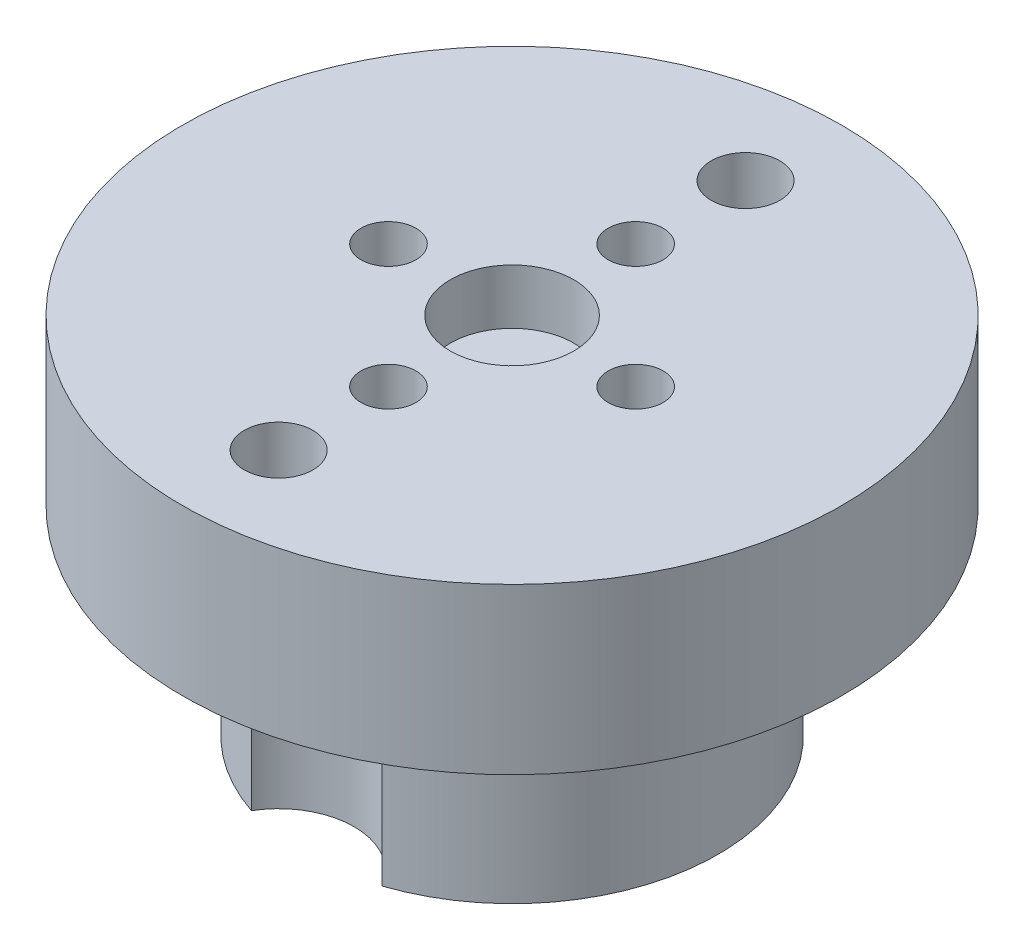
ISO-10303-21;
HEADER;
FILE_DESCRIPTION(('STEP AP214'),'2;1');
FILE_NAME('part.step','',(''),(''),'','','');
FILE_SCHEMA(('AUTOMOTIVE_DESIGN { 1 0 10303 214 1 1 1 1 }'));
ENDSEC;
DATA;
#1=APPLICATION_CONTEXT('core data for automotive mechanical design processes');
#2=APPLICATION_PROTOCOL_DEFINITION('international standard','automotive_design',2000,#1);
#3=PRODUCT_CONTEXT('',#1,'mechanical');
#4=PRODUCT('Part','Part','',(#3));
#5=PRODUCT_RELATED_PRODUCT_CATEGORY('part','',(#4));
#6=PRODUCT_DEFINITION_FORMATION('','',#4);
#7=PRODUCT_DEFINITION_CONTEXT('part definition',#1,'design');
#8=PRODUCT_DEFINITION('design','',#6,#7);
#9=PRODUCT_DEFINITION_SHAPE('','',#8);
#10=(LENGTH_UNIT() NAMED_UNIT(*) SI_UNIT(.MILLI.,.METRE.));
#11=(NAMED_UNIT(*) PLANE_ANGLE_UNIT() SI_UNIT($,.RADIAN.));
#12=(NAMED_UNIT(*) SI_UNIT($,.STERADIAN.) SOLID_ANGLE_UNIT());
#13=UNCERTAINTY_MEASURE_WITH_UNIT(LENGTH_MEASURE(1.E-05),#10,'distance_accuracy_value','');
#14=(GEOMETRIC_REPRESENTATION_CONTEXT(3) GLOBAL_UNCERTAINTY_ASSIGNED_CONTEXT((#13)) GLOBAL_UNIT_ASSIGNED_CONTEXT((#10,
#11,#12)) REPRESENTATION_CONTEXT('',''));
#15=CARTESIAN_POINT('',(0.,0.,0.));
#16=DIRECTION('',(0.,0.,1.));
#17=DIRECTION('',(1.,0.,0.));
#18=AXIS2_PLACEMENT_3D('',#15,#16,#17);
#19=CARTESIAN_POINT('',(0.,0.,0.));
#20=DIRECTION('',(0.,-1.,0.));
#21=DIRECTION('',(0.,0.,-1.));
#22=AXIS2_PLACEMENT_3D('',#19,#20,#21);
#23=CYLINDRICAL_SURFACE('',#22,7.5);
#24=DIRECTION('',(0.,-1.,0.));
#25=VECTOR('',#24,1.);
#26=CARTESIAN_POINT('',(2.3751678824292,4.,-7.1139705882353));
#27=LINE('',#26,#25);
#28=CARTESIAN_POINT('',(2.37516788242919,5.25,-7.1139705882353));
#29=VERTEX_POINT('',#28);
#30=CARTESIAN_POINT('',(2.3751678824292,0.,-7.1139705882353));
#31=VERTEX_POINT('',#30);
#32=EDGE_CURVE('E11',#29,#31,#27,.T.);
#33=ORIENTED_EDGE('',*,*,#32,.F.);
#34=CARTESIAN_POINT('',(0.,5.25,0.));
#35=DIRECTION('',(0.,-1.,0.));
#36=DIRECTION('',(0.,0.,-1.));
#37=AXIS2_PLACEMENT_3D('',#34,#35,#36);
#38=CIRCLE('',#37,7.5);
#39=CARTESIAN_POINT('',(2.3751678824292,5.25,7.1139705882353));
#40=VERTEX_POINT('',#39);
#41=EDGE_CURVE('E120',#29,#40,#38,.T.);
#42=ORIENTED_EDGE('',*,*,#41,.T.);
#43=DIRECTION('',(0.,-1.,0.));
#44=VECTOR('',#43,1.);
#45=CARTESIAN_POINT('',(2.37516788242919,4.,7.1139705882353));
#46=LINE('',#45,#44);
#47=CARTESIAN_POINT('',(2.37516788242919,0.,7.1139705882353));
#48=VERTEX_POINT('',#47);
#49=EDGE_CURVE('E111',#48,#40,#46,.F.);
#50=ORIENTED_EDGE('',*,*,#49,.F.);
#51=CARTESIAN_POINT('',(0.,0.,0.));
#52=DIRECTION('',(0.,-1.,0.));
#53=DIRECTION('',(0.,0.,-1.));
#54=AXIS2_PLACEMENT_3D('',#51,#52,#53);
#55=CIRCLE('',#54,7.5);
#56=EDGE_CURVE('E54',#31,#48,#55,.T.);
#57=ORIENTED_EDGE('',*,*,#56,.F.);
#58=EDGE_LOOP('',(#33,#42,#50,#57));
#59=FACE_BOUND('',#58,.T.);
#60=ADVANCED_FACE('F33',(#59),#23,.T.);
#61=CARTESIAN_POINT('',(0.,3.25,-8.5));
#62=DIRECTION('',(0.,1.,0.));
#63=DIRECTION('',(0.,0.,1.));
#64=AXIS2_PLACEMENT_3D('',#61,#62,#63);
#65=CYLINDRICAL_SURFACE('',#64,1.25);
#66=CARTESIAN_POINT('',(0.,13.25,-8.5));
#67=DIRECTION('',(0.,1.,0.));
#68=DIRECTION('',(0.,0.,1.));
#69=AXIS2_PLACEMENT_3D('',#66,#67,#68);
#70=CIRCLE('',#69,1.25);
#71=CARTESIAN_POINT('',(0.,13.25,-7.25));
#72=VERTEX_POINT('',#71);
#73=EDGE_CURVE('E183',#72,#72,#70,.T.);
#74=ORIENTED_EDGE('',*,*,#73,.T.);
#75=EDGE_LOOP('',(#74));
#76=FACE_BOUND('',#75,.T.);
#77=CARTESIAN_POINT('',(0.,8.,-8.5));
#78=DIRECTION('',(0.,-1.,0.));
#79=DIRECTION('',(0.,0.,-1.));
#80=AXIS2_PLACEMENT_3D('',#77,#78,#79);
#81=CIRCLE('',#80,1.25);
#82=CARTESIAN_POINT('',(0.,8.,-9.75));
#83=VERTEX_POINT('',#82);
#84=EDGE_CURVE('E142',#83,#83,#81,.F.);
#85=ORIENTED_EDGE('',*,*,#84,.F.);
#86=EDGE_LOOP('',(#85));
#87=FACE_BOUND('',#86,.T.);
#88=ADVANCED_FACE('F235',(#76,#87),#65,.F.);
#89=CARTESIAN_POINT('',(0.,3.25,8.5));
#90=DIRECTION('',(0.,1.,0.));
#91=DIRECTION('',(0.,0.,1.));
#92=AXIS2_PLACEMENT_3D('',#89,#90,#91);
#93=CYLINDRICAL_SURFACE('',#92,1.25);
#94=CARTESIAN_POINT('',(0.,13.25,8.5));
#95=DIRECTION('',(0.,1.,0.));
#96=DIRECTION('',(0.,0.,1.));
#97=AXIS2_PLACEMENT_3D('',#94,#95,#96);
#98=CIRCLE('',#97,1.25);
#99=CARTESIAN_POINT('',(0.,13.25,9.75));
#100=VERTEX_POINT('',#99);
#101=EDGE_CURVE('E180',#100,#100,#98,.T.);
#102=ORIENTED_EDGE('',*,*,#101,.T.);
#103=EDGE_LOOP('',(#102));
#104=FACE_BOUND('',#103,.T.);
#105=CARTESIAN_POINT('',(0.,8.,8.5));
#106=DIRECTION('',(0.,-1.,0.));
#107=DIRECTION('',(0.,0.,-1.));
#108=AXIS2_PLACEMENT_3D('',#105,#106,#107);
#109=CIRCLE('',#108,1.25);
#110=CARTESIAN_POINT('',(0.,8.,7.25));
#111=VERTEX_POINT('',#110);
#112=EDGE_CURVE('E134',#111,#111,#109,.F.);
#113=ORIENTED_EDGE('',*,*,#112,.F.);
#114=EDGE_LOOP('',(#113));
#115=FACE_BOUND('',#114,.T.);
#116=ADVANCED_FACE('F240',(#104,#115),#93,.F.);
#117=CARTESIAN_POINT('',(0.,0.,0.));
#118=DIRECTION('',(0.,-1.,0.));
#119=DIRECTION('',(0.,0.,-1.));
#120=AXIS2_PLACEMENT_3D('',#117,#118,#119);
#121=CYLINDRICAL_SURFACE('',#120,8.5);
#122=DIRECTION('',(0.,-1.,0.));
#123=VECTOR('',#122,1.);
#124=CARTESIAN_POINT('',(-2.71378073188064,4.,-8.05514705882353));
#125=LINE('',#124,#123);
#126=CARTESIAN_POINT('',(-2.71378073188064,5.25,-8.05514705882353));
#127=VERTEX_POINT('',#126);
#128=CARTESIAN_POINT('',(-2.71378073188064,7.25,-8.05514705882353));
#129=VERTEX_POINT('',#128);
#130=EDGE_CURVE('E155',#127,#129,#125,.F.);
#131=ORIENTED_EDGE('',*,*,#130,.F.);
#132=CARTESIAN_POINT('',(0.,5.25,0.));
#133=DIRECTION('',(0.,-1.,0.));
#134=DIRECTION('',(0.,0.,-1.));
#135=AXIS2_PLACEMENT_3D('',#132,#133,#134);
#136=CIRCLE('',#135,8.5);
#137=CARTESIAN_POINT('',(-2.71378073188064,5.25,8.05514705882353));
#138=VERTEX_POINT('',#137);
#139=EDGE_CURVE('E122',#138,#127,#136,.T.);
#140=ORIENTED_EDGE('',*,*,#139,.F.);
#141=DIRECTION('',(0.,-1.,0.));
#142=VECTOR('',#141,1.);
#143=CARTESIAN_POINT('',(-2.71378073188064,4.,8.05514705882353));
#144=LINE('',#143,#142);
#145=CARTESIAN_POINT('',(-2.71378073188065,7.25,8.05514705882353));
#146=VERTEX_POINT('',#145);
#147=EDGE_CURVE('E177',#146,#138,#144,.T.);
#148=ORIENTED_EDGE('',*,*,#147,.F.);
#149=CARTESIAN_POINT('',(0.,7.25,0.));
#150=DIRECTION('',(0.,-1.,0.));
#151=DIRECTION('',(0.,0.,-1.));
#152=AXIS2_PLACEMENT_3D('',#149,#150,#151);
#153=CIRCLE('',#152,8.5);
#154=EDGE_CURVE('E125',#146,#129,#153,.T.);
#155=ORIENTED_EDGE('',*,*,#154,.T.);
#156=EDGE_LOOP('',(#131,#140,#148,#155));
#157=FACE_BOUND('',#156,.T.);
#158=ADVANCED_FACE('F232',(#157),#121,.T.);
#159=CARTESIAN_POINT('',(8.5,5.25,0.));
#160=DIRECTION('',(0.,-1.,0.));
#161=DIRECTION('',(0.,0.,-1.));
#162=AXIS2_PLACEMENT_3D('',#159,#160,#161);
#163=PLANE('',#162);
#164=CARTESIAN_POINT('',(0.,5.25,-8.5));
#165=DIRECTION('',(0.,-1.,0.));
#166=DIRECTION('',(0.,0.,-1.));
#167=AXIS2_PLACEMENT_3D('',#164,#165,#166);
#168=CIRCLE('',#167,2.75);
#169=CARTESIAN_POINT('',(2.71378073188064,5.25,-8.05514705882353));
#170=VERTEX_POINT('',#169);
#171=EDGE_CURVE('E99',#170,#29,#168,.T.);
#172=ORIENTED_EDGE('',*,*,#171,.F.);
#173=CARTESIAN_POINT('',(2.71378073188065,5.25,8.05514705882353));
#174=VERTEX_POINT('',#173);
#175=EDGE_CURVE('E123',#170,#174,#136,.T.);
#176=ORIENTED_EDGE('',*,*,#175,.T.);
#177=CARTESIAN_POINT('',(0.,5.25,8.5));
#178=DIRECTION('',(0.,-1.,0.));
#179=DIRECTION('',(0.,0.,-1.));
#180=AXIS2_PLACEMENT_3D('',#177,#178,#179);
#181=CIRCLE('',#180,2.75);
#182=EDGE_CURVE('E137',#40,#174,#181,.T.);
#183=ORIENTED_EDGE('',*,*,#182,.F.);
#184=ORIENTED_EDGE('',*,*,#41,.F.);
#185=EDGE_LOOP('',(#172,#176,#183,#184));
#186=FACE_BOUND('',#185,.T.);
#187=ADVANCED_FACE('F252',(#186),#163,.T.);
#188=CARTESIAN_POINT('',(0.,0.,0.));
#189=DIRECTION('',(0.,-1.,0.));
#190=DIRECTION('',(0.,0.,-1.));
#191=AXIS2_PLACEMENT_3D('',#188,#189,#190);
#192=PLANE('',#191);
#193=CARTESIAN_POINT('',(0.,0.,-8.5));
#194=DIRECTION('',(0.,-1.,0.));
#195=DIRECTION('',(0.,0.,-1.));
#196=AXIS2_PLACEMENT_3D('',#193,#194,#195);
#197=CIRCLE('',#196,2.75);
#198=CARTESIAN_POINT('',(-2.37516788242919,0.,-7.1139705882353));
#199=VERTEX_POINT('',#198);
#200=EDGE_CURVE('E47',#31,#199,#197,.T.);
#201=ORIENTED_EDGE('',*,*,#200,.F.);
#202=ORIENTED_EDGE('',*,*,#56,.T.);
#203=CARTESIAN_POINT('',(0.,0.,8.5));
#204=DIRECTION('',(0.,-1.,0.));
#205=DIRECTION('',(0.,0.,-1.));
#206=AXIS2_PLACEMENT_3D('',#203,#204,#205);
#207=CIRCLE('',#206,2.75);
#208=CARTESIAN_POINT('',(-2.3751678824292,0.,7.1139705882353));
#209=VERTEX_POINT('',#208);
#210=EDGE_CURVE('E162',#209,#48,#207,.T.);
#211=ORIENTED_EDGE('',*,*,#210,.F.);
#212=EDGE_CURVE('E105',#209,#199,#55,.T.);
#213=ORIENTED_EDGE('',*,*,#212,.T.);
#214=EDGE_LOOP('',(#201,#202,#211,#213));
#215=FACE_BOUND('',#214,.T.);
#216=CARTESIAN_POINT('',(0.,0.,-4.5));
#217=DIRECTION('',(0.,1.,0.));
#218=DIRECTION('',(1.,0.,0.));
#219=AXIS2_PLACEMENT_3D('',#216,#217,#218);
#220=CIRCLE('',#219,1.);
#221=CARTESIAN_POINT('',(1.00000000000005,0.,-4.49999999999999));
#222=VERTEX_POINT('',#221);
#223=EDGE_CURVE('E187',#222,#222,#220,.T.);
#224=ORIENTED_EDGE('',*,*,#223,.T.);
#225=EDGE_LOOP('',(#224));
#226=FACE_BOUND('',#225,.T.);
#227=CARTESIAN_POINT('',(-4.5,0.,0.));
#228=DIRECTION('',(0.,1.,0.));
#229=DIRECTION('',(0.,0.,-1.));
#230=AXIS2_PLACEMENT_3D('',#227,#228,#229);
#231=CIRCLE('',#230,1.);
#232=CARTESIAN_POINT('',(-4.5,0.,-1.));
#233=VERTEX_POINT('',#232);
#234=EDGE_CURVE('E193',#233,#233,#231,.T.);
#235=ORIENTED_EDGE('',*,*,#234,.T.);
#236=EDGE_LOOP('',(#235));
#237=FACE_BOUND('',#236,.T.);
#238=CARTESIAN_POINT('',(0.,0.,4.5));
#239=DIRECTION('',(0.,1.,0.));
#240=DIRECTION('',(-1.,0.,0.));
#241=AXIS2_PLACEMENT_3D('',#238,#239,#240);
#242=CIRCLE('',#241,1.);
#243=CARTESIAN_POINT('',(-1.00000000000002,0.,4.5));
#244=VERTEX_POINT('',#243);
#245=EDGE_CURVE('E199',#244,#244,#242,.T.);
#246=ORIENTED_EDGE('',*,*,#245,.T.);
#247=EDGE_LOOP('',(#246));
#248=FACE_BOUND('',#247,.T.);
#249=CARTESIAN_POINT('',(4.5,0.,0.));
#250=DIRECTION('',(0.,1.,0.));
#251=DIRECTION('',(0.,0.,1.));
#252=AXIS2_PLACEMENT_3D('',#249,#250,#251);
#253=CIRCLE('',#252,1.);
#254=CARTESIAN_POINT('',(4.5,0.,1.));
#255=VERTEX_POINT('',#254);
#256=EDGE_CURVE('E112',#255,#255,#253,.T.);
#257=ORIENTED_EDGE('',*,*,#256,.T.);
#258=EDGE_LOOP('',(#257));
#259=FACE_BOUND('',#258,.T.);
#260=ADVANCED_FACE('F35',(#215,#226,#237,#248,#259),#192,.T.);
#261=CARTESIAN_POINT('',(0.,13.25,0.));
#262=DIRECTION('',(0.,1.,0.));
#263=DIRECTION('',(0.,0.,1.));
#264=AXIS2_PLACEMENT_3D('',#261,#262,#263);
#265=PLANE('',#264);
#266=CARTESIAN_POINT('',(0.,13.25,0.));
#267=DIRECTION('',(0.,1.,0.));
#268=DIRECTION('',(0.,0.,1.));
#269=AXIS2_PLACEMENT_3D('',#266,#267,#268);
#270=CIRCLE('',#269,2.25);
#271=CARTESIAN_POINT('',(0.,13.25,2.25));
#272=VERTEX_POINT('',#271);
#273=EDGE_CURVE('E278',#272,#272,#270,.T.);
#274=ORIENTED_EDGE('',*,*,#273,.F.);
#275=EDGE_LOOP('',(#274));
#276=FACE_BOUND('',#275,.T.);
#277=ORIENTED_EDGE('',*,*,#101,.F.);
#278=EDGE_LOOP('',(#277));
#279=FACE_BOUND('',#278,.T.);
#280=ORIENTED_EDGE('',*,*,#73,.F.);
#281=EDGE_LOOP('',(#280));
#282=FACE_BOUND('',#281,.T.);
#283=CARTESIAN_POINT('',(0.,13.25,-4.5));
#284=DIRECTION('',(0.,1.,0.));
#285=DIRECTION('',(1.,0.,0.));
#286=AXIS2_PLACEMENT_3D('',#283,#284,#285);
#287=CIRCLE('',#286,1.);
#288=CARTESIAN_POINT('',(1.00000000000005,13.25,-4.49999999999999));
#289=VERTEX_POINT('',#288);
#290=EDGE_CURVE('E186',#289,#289,#287,.T.);
#291=ORIENTED_EDGE('',*,*,#290,.F.);
#292=EDGE_LOOP('',(#291));
#293=FACE_BOUND('',#292,.T.);
#294=CARTESIAN_POINT('',(-4.5,13.25,0.));
#295=DIRECTION('',(0.,1.,0.));
#296=DIRECTION('',(0.,0.,-1.));
#297=AXIS2_PLACEMENT_3D('',#294,#295,#296);
#298=CIRCLE('',#297,1.);
#299=CARTESIAN_POINT('',(-4.5,13.25,-1.));
#300=VERTEX_POINT('',#299);
#301=EDGE_CURVE('E190',#300,#300,#298,.T.);
#302=ORIENTED_EDGE('',*,*,#301,.F.);
#303=EDGE_LOOP('',(#302));
#304=FACE_BOUND('',#303,.T.);
#305=CARTESIAN_POINT('',(0.,13.25,4.5));
#306=DIRECTION('',(0.,1.,0.));
#307=DIRECTION('',(-1.,0.,0.));
#308=AXIS2_PLACEMENT_3D('',#305,#306,#307);
#309=CIRCLE('',#308,1.);
#310=CARTESIAN_POINT('',(-1.00000000000002,13.25,4.5));
#311=VERTEX_POINT('',#310);
#312=EDGE_CURVE('E196',#311,#311,#309,.T.);
#313=ORIENTED_EDGE('',*,*,#312,.F.);
#314=EDGE_LOOP('',(#313));
#315=FACE_BOUND('',#314,.T.);
#316=CARTESIAN_POINT('',(4.5,13.25,0.));
#317=DIRECTION('',(0.,1.,0.));
#318=DIRECTION('',(0.,0.,1.));
#319=AXIS2_PLACEMENT_3D('',#316,#317,#318);
#320=CIRCLE('',#319,1.);
#321=CARTESIAN_POINT('',(4.5,13.25,1.));
#322=VERTEX_POINT('',#321);
#323=EDGE_CURVE('E116',#322,#322,#320,.T.);
#324=ORIENTED_EDGE('',*,*,#323,.F.);
#325=EDGE_LOOP('',(#324));
#326=FACE_BOUND('',#325,.T.);
#327=CARTESIAN_POINT('',(0.,13.25,0.));
#328=DIRECTION('',(0.,-1.,0.));
#329=DIRECTION('',(0.,0.,-1.));
#330=AXIS2_PLACEMENT_3D('',#327,#328,#329);
#331=CIRCLE('',#330,12.);
#332=CARTESIAN_POINT('',(0.,13.25,-12.));
#333=VERTEX_POINT('',#332);
#334=EDGE_CURVE('E131',#333,#333,#331,.T.);
#335=ORIENTED_EDGE('',*,*,#334,.F.);
#336=EDGE_LOOP('',(#335));
#337=FACE_BOUND('',#336,.T.);
#338=ADVANCED_FACE('F207',(#276,#279,#282,#293,#304,#315,#326,#337),#265,.T.);
#339=CARTESIAN_POINT('',(0.,0.,0.));
#340=DIRECTION('',(0.,-1.,0.));
#341=DIRECTION('',(0.,0.,-1.));
#342=AXIS2_PLACEMENT_3D('',#339,#340,#341);
#343=CYLINDRICAL_SURFACE('',#342,12.);
#344=ORIENTED_EDGE('',*,*,#334,.T.);
#345=EDGE_LOOP('',(#344));
#346=FACE_BOUND('',#345,.T.);
#347=CARTESIAN_POINT('',(0.,7.25,0.));
#348=DIRECTION('',(0.,-1.,0.));
#349=DIRECTION('',(0.,0.,-1.));
#350=AXIS2_PLACEMENT_3D('',#347,#348,#349);
#351=CIRCLE('',#350,12.);
#352=CARTESIAN_POINT('',(0.,7.25,-12.));
#353=VERTEX_POINT('',#352);
#354=EDGE_CURVE('E128',#353,#353,#351,.T.);
#355=ORIENTED_EDGE('',*,*,#354,.F.);
#356=EDGE_LOOP('',(#355));
#357=FACE_BOUND('',#356,.T.);
#358=ADVANCED_FACE('F210',(#346,#357),#343,.T.);
#359=CARTESIAN_POINT('',(8.5,7.25,0.));
#360=DIRECTION('',(0.,-1.,0.));
#361=DIRECTION('',(0.,0.,-1.));
#362=AXIS2_PLACEMENT_3D('',#359,#360,#361);
#363=PLANE('',#362);
#364=CARTESIAN_POINT('',(0.,7.25,-8.5));
#365=DIRECTION('',(0.,-1.,0.));
#366=DIRECTION('',(0.,0.,-1.));
#367=AXIS2_PLACEMENT_3D('',#364,#365,#366);
#368=CIRCLE('',#367,2.75);
#369=CARTESIAN_POINT('',(2.71378073188065,7.25,-8.05514705882353));
#370=VERTEX_POINT('',#369);
#371=EDGE_CURVE('E271',#129,#370,#368,.T.);
#372=ORIENTED_EDGE('',*,*,#371,.F.);
#373=ORIENTED_EDGE('',*,*,#154,.F.);
#374=CARTESIAN_POINT('',(0.,7.25,8.5));
#375=DIRECTION('',(0.,-1.,0.));
#376=DIRECTION('',(0.,0.,-1.));
#377=AXIS2_PLACEMENT_3D('',#374,#375,#376);
#378=CIRCLE('',#377,2.75);
#379=CARTESIAN_POINT('',(2.71378073188064,7.25,8.05514705882353));
#380=VERTEX_POINT('',#379);
#381=EDGE_CURVE('E175',#380,#146,#378,.T.);
#382=ORIENTED_EDGE('',*,*,#381,.F.);
#383=EDGE_CURVE('E126',#370,#380,#153,.T.);
#384=ORIENTED_EDGE('',*,*,#383,.F.);
#385=EDGE_LOOP('',(#372,#373,#382,#384));
#386=FACE_BOUND('',#385,.T.);
#387=ORIENTED_EDGE('',*,*,#354,.T.);
#388=EDGE_LOOP('',(#387));
#389=FACE_BOUND('',#388,.T.);
#390=ADVANCED_FACE('F219',(#386,#389),#363,.T.);
#391=DIRECTION('',(0.,-1.,0.));
#392=VECTOR('',#391,1.);
#393=CARTESIAN_POINT('',(2.71378073188064,4.,-8.05514705882353));
#394=LINE('',#393,#392);
#395=EDGE_CURVE('E167',#370,#170,#394,.T.);
#396=ORIENTED_EDGE('',*,*,#395,.F.);
#397=ORIENTED_EDGE('',*,*,#383,.T.);
#398=DIRECTION('',(0.,-1.,0.));
#399=VECTOR('',#398,1.);
#400=CARTESIAN_POINT('',(2.71378073188064,4.,8.05514705882353));
#401=LINE('',#400,#399);
#402=EDGE_CURVE('E172',#174,#380,#401,.F.);
#403=ORIENTED_EDGE('',*,*,#402,.F.);
#404=ORIENTED_EDGE('',*,*,#175,.F.);
#405=EDGE_LOOP('',(#396,#397,#403,#404));
#406=FACE_BOUND('',#405,.T.);
#407=ADVANCED_FACE('F224',(#406),#121,.T.);
#408=CARTESIAN_POINT('',(0.,5.25,-8.5));
#409=DIRECTION('',(0.,-1.,0.));
#410=DIRECTION('',(0.,0.,-1.));
#411=AXIS2_PLACEMENT_3D('',#408,#409,#410);
#412=CIRCLE('',#411,2.75);
#413=CARTESIAN_POINT('',(-2.3751678824292,5.25,-7.1139705882353));
#414=VERTEX_POINT('',#413);
#415=EDGE_CURVE('E144',#414,#127,#412,.T.);
#416=ORIENTED_EDGE('',*,*,#415,.F.);
#417=CARTESIAN_POINT('',(-2.37516788242919,5.25,7.1139705882353));
#418=VERTEX_POINT('',#417);
#419=EDGE_CURVE('E114',#418,#414,#38,.T.);
#420=ORIENTED_EDGE('',*,*,#419,.F.);
#421=CARTESIAN_POINT('',(0.,5.25,8.5));
#422=DIRECTION('',(0.,-1.,0.));
#423=DIRECTION('',(0.,0.,-1.));
#424=AXIS2_PLACEMENT_3D('',#421,#422,#423);
#425=CIRCLE('',#424,2.75);
#426=EDGE_CURVE('E163',#138,#418,#425,.T.);
#427=ORIENTED_EDGE('',*,*,#426,.F.);
#428=ORIENTED_EDGE('',*,*,#139,.T.);
#429=EDGE_LOOP('',(#416,#420,#427,#428));
#430=FACE_BOUND('',#429,.T.);
#431=ADVANCED_FACE('F152',(#430),#163,.T.);
#432=DIRECTION('',(0.,-1.,0.));
#433=VECTOR('',#432,1.);
#434=CARTESIAN_POINT('',(-2.37516788242919,4.,-7.1139705882353));
#435=LINE('',#434,#433);
#436=EDGE_CURVE('E41',#199,#414,#435,.F.);
#437=ORIENTED_EDGE('',*,*,#436,.F.);
#438=ORIENTED_EDGE('',*,*,#212,.F.);
#439=DIRECTION('',(0.,-1.,0.));
#440=VECTOR('',#439,1.);
#441=CARTESIAN_POINT('',(-2.37516788242919,4.,7.1139705882353));
#442=LINE('',#441,#440);
#443=EDGE_CURVE('E140',#418,#209,#442,.T.);
#444=ORIENTED_EDGE('',*,*,#443,.F.);
#445=ORIENTED_EDGE('',*,*,#419,.T.);
#446=EDGE_LOOP('',(#437,#438,#444,#445));
#447=FACE_BOUND('',#446,.T.);
#448=ADVANCED_FACE('F158',(#447),#23,.T.);
#449=CARTESIAN_POINT('',(4.5,0.,0.));
#450=DIRECTION('',(0.,1.,0.));
#451=DIRECTION('',(0.,0.,1.));
#452=AXIS2_PLACEMENT_3D('',#449,#450,#451);
#453=CYLINDRICAL_SURFACE('',#452,1.);
#454=ORIENTED_EDGE('',*,*,#256,.F.);
#455=EDGE_LOOP('',(#454));
#456=FACE_BOUND('',#455,.T.);
#457=ORIENTED_EDGE('',*,*,#323,.T.);
#458=EDGE_LOOP('',(#457));
#459=FACE_BOUND('',#458,.T.);
#460=ADVANCED_FACE('F246',(#456,#459),#453,.F.);
#461=CARTESIAN_POINT('',(0.,0.,4.5));
#462=DIRECTION('',(0.,1.,0.));
#463=DIRECTION('',(0.,0.,1.));
#464=AXIS2_PLACEMENT_3D('',#461,#462,#463);
#465=CYLINDRICAL_SURFACE('',#464,1.);
#466=ORIENTED_EDGE('',*,*,#245,.F.);
#467=EDGE_LOOP('',(#466));
#468=FACE_BOUND('',#467,.T.);
#469=ORIENTED_EDGE('',*,*,#312,.T.);
#470=EDGE_LOOP('',(#469));
#471=FACE_BOUND('',#470,.T.);
#472=ADVANCED_FACE('F205',(#468,#471),#465,.F.);
#473=CARTESIAN_POINT('',(-4.5,0.,0.));
#474=DIRECTION('',(0.,1.,0.));
#475=DIRECTION('',(0.,0.,1.));
#476=AXIS2_PLACEMENT_3D('',#473,#474,#475);
#477=CYLINDRICAL_SURFACE('',#476,1.);
#478=ORIENTED_EDGE('',*,*,#234,.F.);
#479=EDGE_LOOP('',(#478));
#480=FACE_BOUND('',#479,.T.);
#481=ORIENTED_EDGE('',*,*,#301,.T.);
#482=EDGE_LOOP('',(#481));
#483=FACE_BOUND('',#482,.T.);
#484=ADVANCED_FACE('F300',(#480,#483),#477,.F.);
#485=CARTESIAN_POINT('',(0.,0.,-4.5));
#486=DIRECTION('',(0.,1.,0.));
#487=DIRECTION('',(0.,0.,1.));
#488=AXIS2_PLACEMENT_3D('',#485,#486,#487);
#489=CYLINDRICAL_SURFACE('',#488,1.);
#490=ORIENTED_EDGE('',*,*,#223,.F.);
#491=EDGE_LOOP('',(#490));
#492=FACE_BOUND('',#491,.T.);
#493=ORIENTED_EDGE('',*,*,#290,.T.);
#494=EDGE_LOOP('',(#493));
#495=FACE_BOUND('',#494,.T.);
#496=ADVANCED_FACE('F302',(#492,#495),#489,.F.);
#497=CARTESIAN_POINT('',(0.,8.,8.5));
#498=DIRECTION('',(0.,-1.,0.));
#499=DIRECTION('',(0.,0.,-1.));
#500=AXIS2_PLACEMENT_3D('',#497,#498,#499);
#501=PLANE('',#500);
#502=CARTESIAN_POINT('',(0.,8.,8.5));
#503=DIRECTION('',(0.,-1.,0.));
#504=DIRECTION('',(0.,0.,-1.));
#505=AXIS2_PLACEMENT_3D('',#502,#503,#504);
#506=CIRCLE('',#505,2.75);
#507=CARTESIAN_POINT('',(0.,8.,5.75));
#508=VERTEX_POINT('',#507);
#509=EDGE_CURVE('E138',#508,#508,#506,.T.);
#510=ORIENTED_EDGE('',*,*,#509,.T.);
#511=EDGE_LOOP('',(#510));
#512=FACE_BOUND('',#511,.T.);
#513=ORIENTED_EDGE('',*,*,#112,.T.);
#514=EDGE_LOOP('',(#513));
#515=FACE_BOUND('',#514,.T.);
#516=ADVANCED_FACE('F309',(#512,#515),#501,.T.);
#517=CARTESIAN_POINT('',(0.,8.,8.5));
#518=DIRECTION('',(0.,-1.,0.));
#519=DIRECTION('',(0.,0.,-1.));
#520=AXIS2_PLACEMENT_3D('',#517,#518,#519);
#521=CYLINDRICAL_SURFACE('',#520,2.75);
#522=ORIENTED_EDGE('',*,*,#443,.T.);
#523=ORIENTED_EDGE('',*,*,#210,.T.);
#524=ORIENTED_EDGE('',*,*,#49,.T.);
#525=ORIENTED_EDGE('',*,*,#182,.T.);
#526=ORIENTED_EDGE('',*,*,#402,.T.);
#527=ORIENTED_EDGE('',*,*,#381,.T.);
#528=ORIENTED_EDGE('',*,*,#147,.T.);
#529=ORIENTED_EDGE('',*,*,#426,.T.);
#530=EDGE_LOOP('',(#522,#523,#524,#525,#526,#527,#528,#529));
#531=FACE_BOUND('',#530,.T.);
#532=ORIENTED_EDGE('',*,*,#509,.F.);
#533=EDGE_LOOP('',(#532));
#534=FACE_BOUND('',#533,.T.);
#535=ADVANCED_FACE('F160',(#531,#534),#521,.F.);
#536=CARTESIAN_POINT('',(0.,8.,-8.5));
#537=DIRECTION('',(0.,-1.,0.));
#538=DIRECTION('',(0.,0.,-1.));
#539=AXIS2_PLACEMENT_3D('',#536,#537,#538);
#540=PLANE('',#539);
#541=CARTESIAN_POINT('',(0.,8.,-8.5));
#542=DIRECTION('',(0.,-1.,0.));
#543=DIRECTION('',(0.,0.,-1.));
#544=AXIS2_PLACEMENT_3D('',#541,#542,#543);
#545=CIRCLE('',#544,2.75);
#546=CARTESIAN_POINT('',(0.,8.,-11.25));
#547=VERTEX_POINT('',#546);
#548=EDGE_CURVE('E106',#547,#547,#545,.T.);
#549=ORIENTED_EDGE('',*,*,#548,.T.);
#550=EDGE_LOOP('',(#549));
#551=FACE_BOUND('',#550,.T.);
#552=ORIENTED_EDGE('',*,*,#84,.T.);
#553=EDGE_LOOP('',(#552));
#554=FACE_BOUND('',#553,.T.);
#555=ADVANCED_FACE('F321',(#551,#554),#540,.T.);
#556=CARTESIAN_POINT('',(0.,8.,-8.5));
#557=DIRECTION('',(0.,-1.,0.));
#558=DIRECTION('',(0.,0.,-1.));
#559=AXIS2_PLACEMENT_3D('',#556,#557,#558);
#560=CYLINDRICAL_SURFACE('',#559,2.75);
#561=ORIENTED_EDGE('',*,*,#32,.T.);
#562=ORIENTED_EDGE('',*,*,#200,.T.);
#563=ORIENTED_EDGE('',*,*,#436,.T.);
#564=ORIENTED_EDGE('',*,*,#415,.T.);
#565=ORIENTED_EDGE('',*,*,#130,.T.);
#566=ORIENTED_EDGE('',*,*,#371,.T.);
#567=ORIENTED_EDGE('',*,*,#395,.T.);
#568=ORIENTED_EDGE('',*,*,#171,.T.);
#569=EDGE_LOOP('',(#561,#562,#563,#564,#565,#566,#567,#568));
#570=FACE_BOUND('',#569,.T.);
#571=ORIENTED_EDGE('',*,*,#548,.F.);
#572=EDGE_LOOP('',(#571));
#573=FACE_BOUND('',#572,.T.);
#574=ADVANCED_FACE('F96',(#570,#573),#560,.F.);
#575=CARTESIAN_POINT('',(0.,11.25,0.));
#576=DIRECTION('',(0.,1.,0.));
#577=DIRECTION('',(0.,0.,1.));
#578=AXIS2_PLACEMENT_3D('',#575,#576,#577);
#579=CYLINDRICAL_SURFACE('',#578,2.25);
#580=CARTESIAN_POINT('',(0.,11.25,0.));
#581=DIRECTION('',(0.,1.,0.));
#582=DIRECTION('',(0.,0.,1.));
#583=AXIS2_PLACEMENT_3D('',#580,#581,#582);
#584=CIRCLE('',#583,2.25);
#585=CARTESIAN_POINT('',(0.,11.25,2.25));
#586=VERTEX_POINT('',#585);
#587=EDGE_CURVE('E107',#586,#586,#584,.T.);
#588=ORIENTED_EDGE('',*,*,#587,.F.);
#589=EDGE_LOOP('',(#588));
#590=FACE_BOUND('',#589,.T.);
#591=ORIENTED_EDGE('',*,*,#273,.T.);
#592=EDGE_LOOP('',(#591));
#593=FACE_BOUND('',#592,.T.);
#594=ADVANCED_FACE('F286',(#590,#593),#579,.F.);
#595=CARTESIAN_POINT('',(0.,11.25,0.));
#596=DIRECTION('',(0.,1.,0.));
#597=DIRECTION('',(0.,0.,1.));
#598=AXIS2_PLACEMENT_3D('',#595,#596,#597);
#599=PLANE('',#598);
#600=ORIENTED_EDGE('',*,*,#587,.T.);
#601=EDGE_LOOP('',(#600));
#602=FACE_BOUND('',#601,.T.);
#603=ADVANCED_FACE('F284',(#602),#599,.T.);
#604=CLOSED_SHELL('',(#60,#88,#116,#158,#187,#260,#338,#358,#390,#407,#431,#448,#460,#472,#484,
#496,#516,#535,#555,#574,#594,#603));
#605=MANIFOLD_SOLID_BREP('B2',#604);
#606=ADVANCED_BREP_SHAPE_REPRESENTATION('',(#18,#605),#14);
#607=SHAPE_DEFINITION_REPRESENTATION(#9,#606);
ENDSEC;
END-ISO-10303-21;
